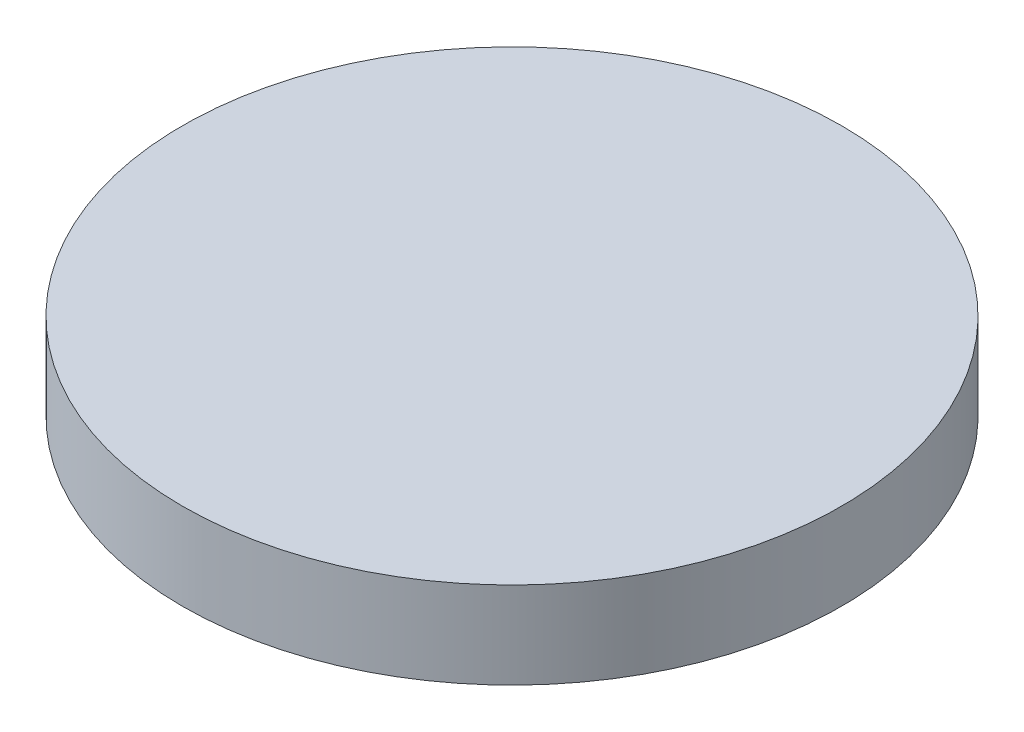
ISO-10303-21;
HEADER;
FILE_DESCRIPTION(('STEP AP214'),'2;1');
FILE_NAME('part.step','',(''),(''),'','','');
FILE_SCHEMA(('AUTOMOTIVE_DESIGN { 1 0 10303 214 1 1 1 1 }'));
ENDSEC;
DATA;
#1=APPLICATION_CONTEXT('core data for automotive mechanical design processes');
#2=APPLICATION_PROTOCOL_DEFINITION('international standard','automotive_design',2000,#1);
#3=PRODUCT_CONTEXT('',#1,'mechanical');
#4=PRODUCT('Part','Part','',(#3));
#5=PRODUCT_RELATED_PRODUCT_CATEGORY('part','',(#4));
#6=PRODUCT_DEFINITION_FORMATION('','',#4);
#7=PRODUCT_DEFINITION_CONTEXT('part definition',#1,'design');
#8=PRODUCT_DEFINITION('design','',#6,#7);
#9=PRODUCT_DEFINITION_SHAPE('','',#8);
#10=(LENGTH_UNIT() NAMED_UNIT(*) SI_UNIT(.MILLI.,.METRE.));
#11=(NAMED_UNIT(*) PLANE_ANGLE_UNIT() SI_UNIT($,.RADIAN.));
#12=(NAMED_UNIT(*) SI_UNIT($,.STERADIAN.) SOLID_ANGLE_UNIT());
#13=UNCERTAINTY_MEASURE_WITH_UNIT(LENGTH_MEASURE(1.E-05),#10,'distance_accuracy_value','');
#14=(GEOMETRIC_REPRESENTATION_CONTEXT(3) GLOBAL_UNCERTAINTY_ASSIGNED_CONTEXT((#13)) GLOBAL_UNIT_ASSIGNED_CONTEXT((#10,
#11,#12)) REPRESENTATION_CONTEXT('',''));
#15=CARTESIAN_POINT('',(0.,0.,0.));
#16=DIRECTION('',(0.,0.,1.));
#17=DIRECTION('',(1.,0.,0.));
#18=AXIS2_PLACEMENT_3D('',#15,#16,#17);
#19=CARTESIAN_POINT('',(4.99965588230111,3.175,4.96193611928675));
#20=DIRECTION('',(0.,-1.,0.));
#21=DIRECTION('',(0.,0.,-1.));
#22=AXIS2_PLACEMENT_3D('',#19,#20,#21);
#23=CYLINDRICAL_SURFACE('',#22,12.065);
#24=CARTESIAN_POINT('',(4.99965588230111,3.175,4.96193611928675));
#25=DIRECTION('',(0.,1.,0.));
#26=DIRECTION('',(0.,0.,1.));
#27=AXIS2_PLACEMENT_3D('',#24,#25,#26);
#28=CIRCLE('',#27,12.065);
#29=CARTESIAN_POINT('',(4.99965588230111,3.175,17.0269361192867));
#30=VERTEX_POINT('',#29);
#31=EDGE_CURVE('E10',#30,#30,#28,.T.);
#32=ORIENTED_EDGE('',*,*,#31,.F.);
#33=EDGE_LOOP('',(#32));
#34=FACE_BOUND('',#33,.T.);
#35=CARTESIAN_POINT('',(4.99965588230111,0.,4.96193611928675));
#36=DIRECTION('',(0.,1.,0.));
#37=DIRECTION('',(0.,0.,1.));
#38=AXIS2_PLACEMENT_3D('',#35,#36,#37);
#39=CIRCLE('',#38,12.065);
#40=CARTESIAN_POINT('',(4.99965588230111,0.,17.0269361192867));
#41=VERTEX_POINT('',#40);
#42=EDGE_CURVE('E36',#41,#41,#39,.T.);
#43=ORIENTED_EDGE('',*,*,#42,.T.);
#44=EDGE_LOOP('',(#43));
#45=FACE_BOUND('',#44,.T.);
#46=ADVANCED_FACE('F33',(#34,#45),#23,.T.);
#47=CARTESIAN_POINT('',(4.99965588230111,3.175,4.96193611928675));
#48=DIRECTION('',(0.,1.,0.));
#49=DIRECTION('',(0.,0.,1.));
#50=AXIS2_PLACEMENT_3D('',#47,#48,#49);
#51=PLANE('',#50);
#52=ORIENTED_EDGE('',*,*,#31,.T.);
#53=EDGE_LOOP('',(#52));
#54=FACE_BOUND('',#53,.T.);
#55=ADVANCED_FACE('F48',(#54),#51,.T.);
#56=CARTESIAN_POINT('',(4.99965588230111,0.,4.96193611928675));
#57=DIRECTION('',(0.,1.,0.));
#58=DIRECTION('',(0.,0.,1.));
#59=AXIS2_PLACEMENT_3D('',#56,#57,#58);
#60=PLANE('',#59);
#61=ORIENTED_EDGE('',*,*,#42,.F.);
#62=EDGE_LOOP('',(#61));
#63=FACE_BOUND('',#62,.T.);
#64=ADVANCED_FACE('F46',(#63),#60,.F.);
#65=CLOSED_SHELL('',(#46,#55,#64));
#66=MANIFOLD_SOLID_BREP('B2',#65);
#67=ADVANCED_BREP_SHAPE_REPRESENTATION('',(#18,#66),#14);
#68=SHAPE_DEFINITION_REPRESENTATION(#9,#67);
ENDSEC;
END-ISO-10303-21;
